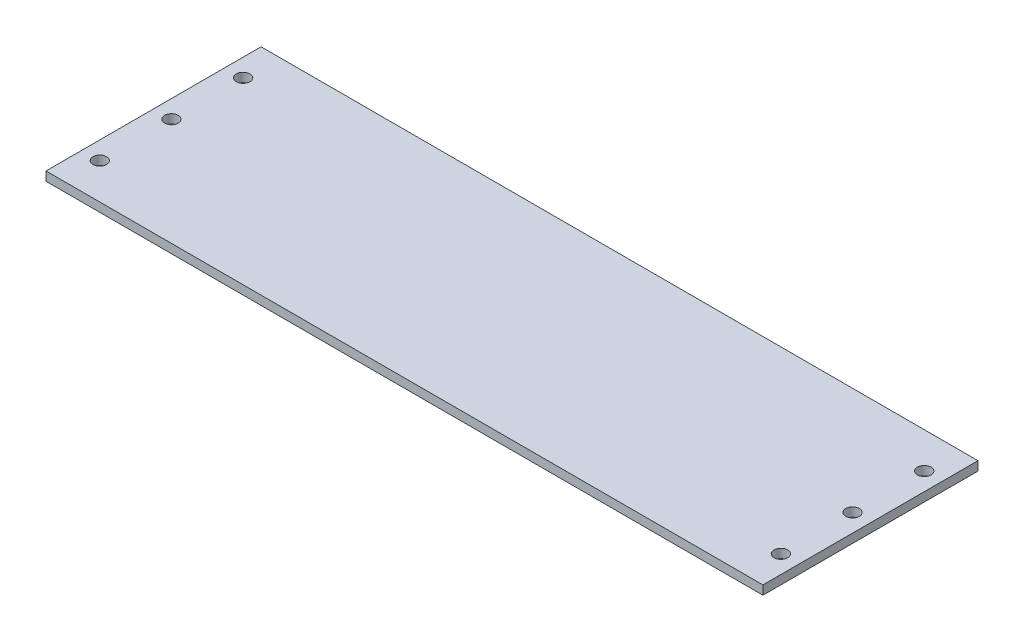
ISO-10303-21;
HEADER;
FILE_DESCRIPTION(('STEP AP214'),'2;1');
FILE_NAME('part.step','',(''),(''),'','','');
FILE_SCHEMA(('AUTOMOTIVE_DESIGN { 1 0 10303 214 1 1 1 1 }'));
ENDSEC;
DATA;
#1=APPLICATION_CONTEXT('core data for automotive mechanical design processes');
#2=APPLICATION_PROTOCOL_DEFINITION('international standard','automotive_design',2000,#1);
#3=PRODUCT_CONTEXT('',#1,'mechanical');
#4=PRODUCT('Part','Part','',(#3));
#5=PRODUCT_RELATED_PRODUCT_CATEGORY('part','',(#4));
#6=PRODUCT_DEFINITION_FORMATION('','',#4);
#7=PRODUCT_DEFINITION_CONTEXT('part definition',#1,'design');
#8=PRODUCT_DEFINITION('design','',#6,#7);
#9=PRODUCT_DEFINITION_SHAPE('','',#8);
#10=(LENGTH_UNIT() NAMED_UNIT(*) SI_UNIT(.MILLI.,.METRE.));
#11=(NAMED_UNIT(*) PLANE_ANGLE_UNIT() SI_UNIT($,.RADIAN.));
#12=(NAMED_UNIT(*) SI_UNIT($,.STERADIAN.) SOLID_ANGLE_UNIT());
#13=UNCERTAINTY_MEASURE_WITH_UNIT(LENGTH_MEASURE(1.E-05),#10,'distance_accuracy_value','');
#14=(GEOMETRIC_REPRESENTATION_CONTEXT(3) GLOBAL_UNCERTAINTY_ASSIGNED_CONTEXT((#13)) GLOBAL_UNIT_ASSIGNED_CONTEXT((#10,
#11,#12)) REPRESENTATION_CONTEXT('',''));
#15=CARTESIAN_POINT('',(0.,0.,0.));
#16=DIRECTION('',(0.,0.,1.));
#17=DIRECTION('',(1.,0.,0.));
#18=AXIS2_PLACEMENT_3D('',#15,#16,#17);
#19=CARTESIAN_POINT('',(0.,3.175,0.));
#20=DIRECTION('',(0.,-1.,0.));
#21=DIRECTION('',(0.,0.,-1.));
#22=AXIS2_PLACEMENT_3D('',#19,#20,#21);
#23=PLANE('',#22);
#24=DIRECTION('',(0.,0.,1.));
#25=VECTOR('',#24,1.);
#26=CARTESIAN_POINT('',(0.,3.175,0.));
#27=LINE('',#26,#25);
#28=CARTESIAN_POINT('',(0.,3.175,-76.2));
#29=VERTEX_POINT('',#28);
#30=CARTESIAN_POINT('',(0.,3.175,0.));
#31=VERTEX_POINT('',#30);
#32=EDGE_CURVE('E92',#29,#31,#27,.T.);
#33=ORIENTED_EDGE('',*,*,#32,.T.);
#34=DIRECTION('',(1.,0.,0.));
#35=VECTOR('',#34,1.);
#36=CARTESIAN_POINT('',(0.,3.175,0.));
#37=LINE('',#36,#35);
#38=CARTESIAN_POINT('',(254.,3.175,0.));
#39=VERTEX_POINT('',#38);
#40=EDGE_CURVE('E87',#31,#39,#37,.T.);
#41=ORIENTED_EDGE('',*,*,#40,.T.);
#42=DIRECTION('',(0.,0.,-1.));
#43=VECTOR('',#42,1.);
#44=CARTESIAN_POINT('',(254.,3.175,0.));
#45=LINE('',#44,#43);
#46=CARTESIAN_POINT('',(254.,3.175,-76.2));
#47=VERTEX_POINT('',#46);
#48=EDGE_CURVE('E90',#39,#47,#45,.T.);
#49=ORIENTED_EDGE('',*,*,#48,.T.);
#50=DIRECTION('',(-1.,0.,0.));
#51=VECTOR('',#50,1.);
#52=CARTESIAN_POINT('',(0.,3.175,-76.2));
#53=LINE('',#52,#51);
#54=EDGE_CURVE('E57',#47,#29,#53,.T.);
#55=ORIENTED_EDGE('',*,*,#54,.T.);
#56=EDGE_LOOP('',(#33,#41,#49,#55));
#57=FACE_BOUND('',#56,.T.);
#58=CARTESIAN_POINT('',(6.35,3.175,-63.5));
#59=DIRECTION('',(0.,1.,0.));
#60=DIRECTION('',(0.,0.,1.));
#61=AXIS2_PLACEMENT_3D('',#58,#59,#60);
#62=CIRCLE('',#61,2.413);
#63=CARTESIAN_POINT('',(6.35,3.175,-61.087));
#64=VERTEX_POINT('',#63);
#65=EDGE_CURVE('E112',#64,#64,#62,.T.);
#66=ORIENTED_EDGE('',*,*,#65,.F.);
#67=EDGE_LOOP('',(#66));
#68=FACE_BOUND('',#67,.T.);
#69=CARTESIAN_POINT('',(6.35000000000027,3.175,-38.1));
#70=DIRECTION('',(0.,1.,0.));
#71=DIRECTION('',(0.,0.,1.));
#72=AXIS2_PLACEMENT_3D('',#69,#70,#71);
#73=CIRCLE('',#72,2.413);
#74=CARTESIAN_POINT('',(6.35000000000027,3.175,-35.687));
#75=VERTEX_POINT('',#74);
#76=EDGE_CURVE('E134',#75,#75,#73,.T.);
#77=ORIENTED_EDGE('',*,*,#76,.F.);
#78=EDGE_LOOP('',(#77));
#79=FACE_BOUND('',#78,.T.);
#80=CARTESIAN_POINT('',(6.35000000000053,3.175,-12.7));
#81=DIRECTION('',(0.,1.,0.));
#82=DIRECTION('',(0.,0.,1.));
#83=AXIS2_PLACEMENT_3D('',#80,#81,#82);
#84=CIRCLE('',#83,2.413);
#85=CARTESIAN_POINT('',(6.35000000000053,3.175,-10.287));
#86=VERTEX_POINT('',#85);
#87=EDGE_CURVE('E142',#86,#86,#84,.T.);
#88=ORIENTED_EDGE('',*,*,#87,.F.);
#89=EDGE_LOOP('',(#88));
#90=FACE_BOUND('',#89,.T.);
#91=CARTESIAN_POINT('',(247.649999999999,3.175,-12.7000000000001));
#92=DIRECTION('',(0.,1.,0.));
#93=DIRECTION('',(0.,0.,-1.));
#94=AXIS2_PLACEMENT_3D('',#91,#92,#93);
#95=CIRCLE('',#94,2.41300000000002);
#96=CARTESIAN_POINT('',(247.649999999999,3.175,-15.1130000000001));
#97=VERTEX_POINT('',#96);
#98=EDGE_CURVE('E150',#97,#97,#95,.T.);
#99=ORIENTED_EDGE('',*,*,#98,.F.);
#100=EDGE_LOOP('',(#99));
#101=FACE_BOUND('',#100,.T.);
#102=CARTESIAN_POINT('',(247.65,3.175,-38.1));
#103=DIRECTION('',(0.,1.,0.));
#104=DIRECTION('',(0.,0.,-1.));
#105=AXIS2_PLACEMENT_3D('',#102,#103,#104);
#106=CIRCLE('',#105,2.41300000000003);
#107=CARTESIAN_POINT('',(247.65,3.175,-40.5130000000001));
#108=VERTEX_POINT('',#107);
#109=EDGE_CURVE('E158',#108,#108,#106,.T.);
#110=ORIENTED_EDGE('',*,*,#109,.F.);
#111=EDGE_LOOP('',(#110));
#112=FACE_BOUND('',#111,.T.);
#113=CARTESIAN_POINT('',(247.65,3.175,-63.5));
#114=DIRECTION('',(0.,1.,0.));
#115=DIRECTION('',(0.,0.,-1.));
#116=AXIS2_PLACEMENT_3D('',#113,#114,#115);
#117=CIRCLE('',#116,2.41300000000003);
#118=CARTESIAN_POINT('',(247.65,3.175,-65.913));
#119=VERTEX_POINT('',#118);
#120=EDGE_CURVE('E166',#119,#119,#117,.T.);
#121=ORIENTED_EDGE('',*,*,#120,.F.);
#122=EDGE_LOOP('',(#121));
#123=FACE_BOUND('',#122,.T.);
#124=ADVANCED_FACE('F39',(#57,#68,#79,#90,#101,#112,#123),#23,.F.);
#125=CARTESIAN_POINT('',(0.,0.,0.));
#126=DIRECTION('',(0.,-1.,0.));
#127=DIRECTION('',(0.,0.,-1.));
#128=AXIS2_PLACEMENT_3D('',#125,#126,#127);
#129=PLANE('',#128);
#130=CARTESIAN_POINT('',(247.65,0.,-38.1));
#131=DIRECTION('',(0.,1.,0.));
#132=DIRECTION('',(0.,0.,-1.));
#133=AXIS2_PLACEMENT_3D('',#130,#131,#132);
#134=CIRCLE('',#133,2.41300000000003);
#135=CARTESIAN_POINT('',(247.65,0.,-40.5130000000001));
#136=VERTEX_POINT('',#135);
#137=EDGE_CURVE('E162',#136,#136,#134,.T.);
#138=ORIENTED_EDGE('',*,*,#137,.T.);
#139=EDGE_LOOP('',(#138));
#140=FACE_BOUND('',#139,.T.);
#141=CARTESIAN_POINT('',(6.35000000000053,0.,-12.7));
#142=DIRECTION('',(0.,1.,0.));
#143=DIRECTION('',(0.,0.,1.));
#144=AXIS2_PLACEMENT_3D('',#141,#142,#143);
#145=CIRCLE('',#144,2.413);
#146=CARTESIAN_POINT('',(6.35000000000053,0.,-10.287));
#147=VERTEX_POINT('',#146);
#148=EDGE_CURVE('E146',#147,#147,#145,.T.);
#149=ORIENTED_EDGE('',*,*,#148,.T.);
#150=EDGE_LOOP('',(#149));
#151=FACE_BOUND('',#150,.T.);
#152=CARTESIAN_POINT('',(6.35,0.,-63.5));
#153=DIRECTION('',(0.,1.,0.));
#154=DIRECTION('',(0.,0.,1.));
#155=AXIS2_PLACEMENT_3D('',#152,#153,#154);
#156=CIRCLE('',#155,2.413);
#157=CARTESIAN_POINT('',(6.35,0.,-61.087));
#158=VERTEX_POINT('',#157);
#159=EDGE_CURVE('E130',#158,#158,#156,.T.);
#160=ORIENTED_EDGE('',*,*,#159,.T.);
#161=EDGE_LOOP('',(#160));
#162=FACE_BOUND('',#161,.T.);
#163=DIRECTION('',(0.,0.,1.));
#164=VECTOR('',#163,1.);
#165=CARTESIAN_POINT('',(0.,0.,0.));
#166=LINE('',#165,#164);
#167=CARTESIAN_POINT('',(0.,0.,-76.2));
#168=VERTEX_POINT('',#167);
#169=CARTESIAN_POINT('',(0.,0.,0.));
#170=VERTEX_POINT('',#169);
#171=EDGE_CURVE('E108',#168,#170,#166,.T.);
#172=ORIENTED_EDGE('',*,*,#171,.F.);
#173=DIRECTION('',(-1.,0.,0.));
#174=VECTOR('',#173,1.);
#175=CARTESIAN_POINT('',(0.,0.,-76.2));
#176=LINE('',#175,#174);
#177=CARTESIAN_POINT('',(254.,0.,-76.2));
#178=VERTEX_POINT('',#177);
#179=EDGE_CURVE('E80',#178,#168,#176,.T.);
#180=ORIENTED_EDGE('',*,*,#179,.F.);
#181=DIRECTION('',(0.,0.,-1.));
#182=VECTOR('',#181,1.);
#183=CARTESIAN_POINT('',(254.,0.,0.));
#184=LINE('',#183,#182);
#185=CARTESIAN_POINT('',(254.,0.,0.));
#186=VERTEX_POINT('',#185);
#187=EDGE_CURVE('E74',#186,#178,#184,.T.);
#188=ORIENTED_EDGE('',*,*,#187,.F.);
#189=DIRECTION('',(1.,0.,0.));
#190=VECTOR('',#189,1.);
#191=CARTESIAN_POINT('',(0.,0.,0.));
#192=LINE('',#191,#190);
#193=EDGE_CURVE('E97',#170,#186,#192,.T.);
#194=ORIENTED_EDGE('',*,*,#193,.F.);
#195=EDGE_LOOP('',(#172,#180,#188,#194));
#196=FACE_BOUND('',#195,.T.);
#197=CARTESIAN_POINT('',(6.35000000000027,0.,-38.1));
#198=DIRECTION('',(0.,1.,0.));
#199=DIRECTION('',(0.,0.,1.));
#200=AXIS2_PLACEMENT_3D('',#197,#198,#199);
#201=CIRCLE('',#200,2.413);
#202=CARTESIAN_POINT('',(6.35000000000027,0.,-35.687));
#203=VERTEX_POINT('',#202);
#204=EDGE_CURVE('E138',#203,#203,#201,.T.);
#205=ORIENTED_EDGE('',*,*,#204,.T.);
#206=EDGE_LOOP('',(#205));
#207=FACE_BOUND('',#206,.T.);
#208=CARTESIAN_POINT('',(247.649999999999,0.,-12.7000000000001));
#209=DIRECTION('',(0.,1.,0.));
#210=DIRECTION('',(0.,0.,-1.));
#211=AXIS2_PLACEMENT_3D('',#208,#209,#210);
#212=CIRCLE('',#211,2.41300000000002);
#213=CARTESIAN_POINT('',(247.649999999999,0.,-15.1130000000001));
#214=VERTEX_POINT('',#213);
#215=EDGE_CURVE('E154',#214,#214,#212,.T.);
#216=ORIENTED_EDGE('',*,*,#215,.T.);
#217=EDGE_LOOP('',(#216));
#218=FACE_BOUND('',#217,.T.);
#219=CARTESIAN_POINT('',(247.65,0.,-63.5));
#220=DIRECTION('',(0.,1.,0.));
#221=DIRECTION('',(0.,0.,-1.));
#222=AXIS2_PLACEMENT_3D('',#219,#220,#221);
#223=CIRCLE('',#222,2.41300000000003);
#224=CARTESIAN_POINT('',(247.65,0.,-65.913));
#225=VERTEX_POINT('',#224);
#226=EDGE_CURVE('E170',#225,#225,#223,.T.);
#227=ORIENTED_EDGE('',*,*,#226,.T.);
#228=EDGE_LOOP('',(#227));
#229=FACE_BOUND('',#228,.T.);
#230=ADVANCED_FACE('F125',(#140,#151,#162,#196,#207,#218,#229),#129,.T.);
#231=CARTESIAN_POINT('',(0.,3.175,0.));
#232=DIRECTION('',(1.,0.,0.));
#233=DIRECTION('',(0.,0.,-1.));
#234=AXIS2_PLACEMENT_3D('',#231,#232,#233);
#235=PLANE('',#234);
#236=ORIENTED_EDGE('',*,*,#171,.T.);
#237=DIRECTION('',(0.,-1.,0.));
#238=VECTOR('',#237,1.);
#239=CARTESIAN_POINT('',(0.,3.175,0.));
#240=LINE('',#239,#238);
#241=EDGE_CURVE('E11',#31,#170,#240,.T.);
#242=ORIENTED_EDGE('',*,*,#241,.F.);
#243=ORIENTED_EDGE('',*,*,#32,.F.);
#244=DIRECTION('',(0.,-1.,0.));
#245=VECTOR('',#244,1.);
#246=CARTESIAN_POINT('',(0.,3.175,-76.2));
#247=LINE('',#246,#245);
#248=EDGE_CURVE('E104',#29,#168,#247,.T.);
#249=ORIENTED_EDGE('',*,*,#248,.T.);
#250=EDGE_LOOP('',(#236,#242,#243,#249));
#251=FACE_BOUND('',#250,.T.);
#252=ADVANCED_FACE('F41',(#251),#235,.F.);
#253=CARTESIAN_POINT('',(0.,3.175,0.));
#254=DIRECTION('',(0.,0.,-1.));
#255=DIRECTION('',(-1.,0.,0.));
#256=AXIS2_PLACEMENT_3D('',#253,#254,#255);
#257=PLANE('',#256);
#258=ORIENTED_EDGE('',*,*,#193,.T.);
#259=DIRECTION('',(0.,-1.,0.));
#260=VECTOR('',#259,1.);
#261=CARTESIAN_POINT('',(254.,3.175,0.));
#262=LINE('',#261,#260);
#263=EDGE_CURVE('E49',#39,#186,#262,.T.);
#264=ORIENTED_EDGE('',*,*,#263,.F.);
#265=ORIENTED_EDGE('',*,*,#40,.F.);
#266=ORIENTED_EDGE('',*,*,#241,.T.);
#267=EDGE_LOOP('',(#258,#264,#265,#266));
#268=FACE_BOUND('',#267,.T.);
#269=ADVANCED_FACE('F96',(#268),#257,.F.);
#270=CARTESIAN_POINT('',(254.,3.175,0.));
#271=DIRECTION('',(-1.,0.,0.));
#272=DIRECTION('',(0.,0.,1.));
#273=AXIS2_PLACEMENT_3D('',#270,#271,#272);
#274=PLANE('',#273);
#275=ORIENTED_EDGE('',*,*,#187,.T.);
#276=DIRECTION('',(0.,-1.,0.));
#277=VECTOR('',#276,1.);
#278=CARTESIAN_POINT('',(254.,3.175,-76.2));
#279=LINE('',#278,#277);
#280=EDGE_CURVE('E99',#47,#178,#279,.T.);
#281=ORIENTED_EDGE('',*,*,#280,.F.);
#282=ORIENTED_EDGE('',*,*,#48,.F.);
#283=ORIENTED_EDGE('',*,*,#263,.T.);
#284=EDGE_LOOP('',(#275,#281,#282,#283));
#285=FACE_BOUND('',#284,.T.);
#286=ADVANCED_FACE('F100',(#285),#274,.F.);
#287=CARTESIAN_POINT('',(0.,3.175,-76.2));
#288=DIRECTION('',(0.,0.,1.));
#289=DIRECTION('',(1.,0.,0.));
#290=AXIS2_PLACEMENT_3D('',#287,#288,#289);
#291=PLANE('',#290);
#292=ORIENTED_EDGE('',*,*,#179,.T.);
#293=ORIENTED_EDGE('',*,*,#248,.F.);
#294=ORIENTED_EDGE('',*,*,#54,.F.);
#295=ORIENTED_EDGE('',*,*,#280,.T.);
#296=EDGE_LOOP('',(#292,#293,#294,#295));
#297=FACE_BOUND('',#296,.T.);
#298=ADVANCED_FACE('F122',(#297),#291,.F.);
#299=CARTESIAN_POINT('',(6.35,3.175,-63.5));
#300=DIRECTION('',(0.,-1.,0.));
#301=DIRECTION('',(0.,0.,-1.));
#302=AXIS2_PLACEMENT_3D('',#299,#300,#301);
#303=CYLINDRICAL_SURFACE('',#302,2.413);
#304=ORIENTED_EDGE('',*,*,#65,.T.);
#305=EDGE_LOOP('',(#304));
#306=FACE_BOUND('',#305,.T.);
#307=ORIENTED_EDGE('',*,*,#159,.F.);
#308=EDGE_LOOP('',(#307));
#309=FACE_BOUND('',#308,.T.);
#310=ADVANCED_FACE('F189',(#306,#309),#303,.F.);
#311=CARTESIAN_POINT('',(6.35000000000027,3.175,-38.1));
#312=DIRECTION('',(0.,-1.,0.));
#313=DIRECTION('',(0.,0.,-1.));
#314=AXIS2_PLACEMENT_3D('',#311,#312,#313);
#315=CYLINDRICAL_SURFACE('',#314,2.413);
#316=ORIENTED_EDGE('',*,*,#76,.T.);
#317=EDGE_LOOP('',(#316));
#318=FACE_BOUND('',#317,.T.);
#319=ORIENTED_EDGE('',*,*,#204,.F.);
#320=EDGE_LOOP('',(#319));
#321=FACE_BOUND('',#320,.T.);
#322=ADVANCED_FACE('F235',(#318,#321),#315,.F.);
#323=CARTESIAN_POINT('',(6.35000000000053,3.175,-12.7));
#324=DIRECTION('',(0.,-1.,0.));
#325=DIRECTION('',(0.,0.,-1.));
#326=AXIS2_PLACEMENT_3D('',#323,#324,#325);
#327=CYLINDRICAL_SURFACE('',#326,2.413);
#328=ORIENTED_EDGE('',*,*,#87,.T.);
#329=EDGE_LOOP('',(#328));
#330=FACE_BOUND('',#329,.T.);
#331=ORIENTED_EDGE('',*,*,#148,.F.);
#332=EDGE_LOOP('',(#331));
#333=FACE_BOUND('',#332,.T.);
#334=ADVANCED_FACE('F243',(#330,#333),#327,.F.);
#335=CARTESIAN_POINT('',(247.649999999999,3.175,-12.7000000000001));
#336=DIRECTION('',(0.,-1.,0.));
#337=DIRECTION('',(0.,0.,-1.));
#338=AXIS2_PLACEMENT_3D('',#335,#336,#337);
#339=CYLINDRICAL_SURFACE('',#338,2.41300000000002);
#340=ORIENTED_EDGE('',*,*,#98,.T.);
#341=EDGE_LOOP('',(#340));
#342=FACE_BOUND('',#341,.T.);
#343=ORIENTED_EDGE('',*,*,#215,.F.);
#344=EDGE_LOOP('',(#343));
#345=FACE_BOUND('',#344,.T.);
#346=ADVANCED_FACE('F251',(#342,#345),#339,.F.);
#347=CARTESIAN_POINT('',(247.65,3.175,-38.1));
#348=DIRECTION('',(0.,-1.,0.));
#349=DIRECTION('',(0.,0.,-1.));
#350=AXIS2_PLACEMENT_3D('',#347,#348,#349);
#351=CYLINDRICAL_SURFACE('',#350,2.41300000000003);
#352=ORIENTED_EDGE('',*,*,#109,.T.);
#353=EDGE_LOOP('',(#352));
#354=FACE_BOUND('',#353,.T.);
#355=ORIENTED_EDGE('',*,*,#137,.F.);
#356=EDGE_LOOP('',(#355));
#357=FACE_BOUND('',#356,.T.);
#358=ADVANCED_FACE('F260',(#354,#357),#351,.F.);
#359=CARTESIAN_POINT('',(247.65,3.175,-63.5));
#360=DIRECTION('',(0.,-1.,0.));
#361=DIRECTION('',(0.,0.,-1.));
#362=AXIS2_PLACEMENT_3D('',#359,#360,#361);
#363=CYLINDRICAL_SURFACE('',#362,2.41300000000003);
#364=ORIENTED_EDGE('',*,*,#120,.T.);
#365=EDGE_LOOP('',(#364));
#366=FACE_BOUND('',#365,.T.);
#367=ORIENTED_EDGE('',*,*,#226,.F.);
#368=EDGE_LOOP('',(#367));
#369=FACE_BOUND('',#368,.T.);
#370=ADVANCED_FACE('F178',(#366,#369),#363,.F.);
#371=CLOSED_SHELL('',(#124,#230,#252,#269,#286,#298,#310,#322,#334,#346,#358,#370));
#372=MANIFOLD_SOLID_BREP('B2',#371);
#373=ADVANCED_BREP_SHAPE_REPRESENTATION('',(#18,#372),#14);
#374=SHAPE_DEFINITION_REPRESENTATION(#9,#373);
ENDSEC;
END-ISO-10303-21;
